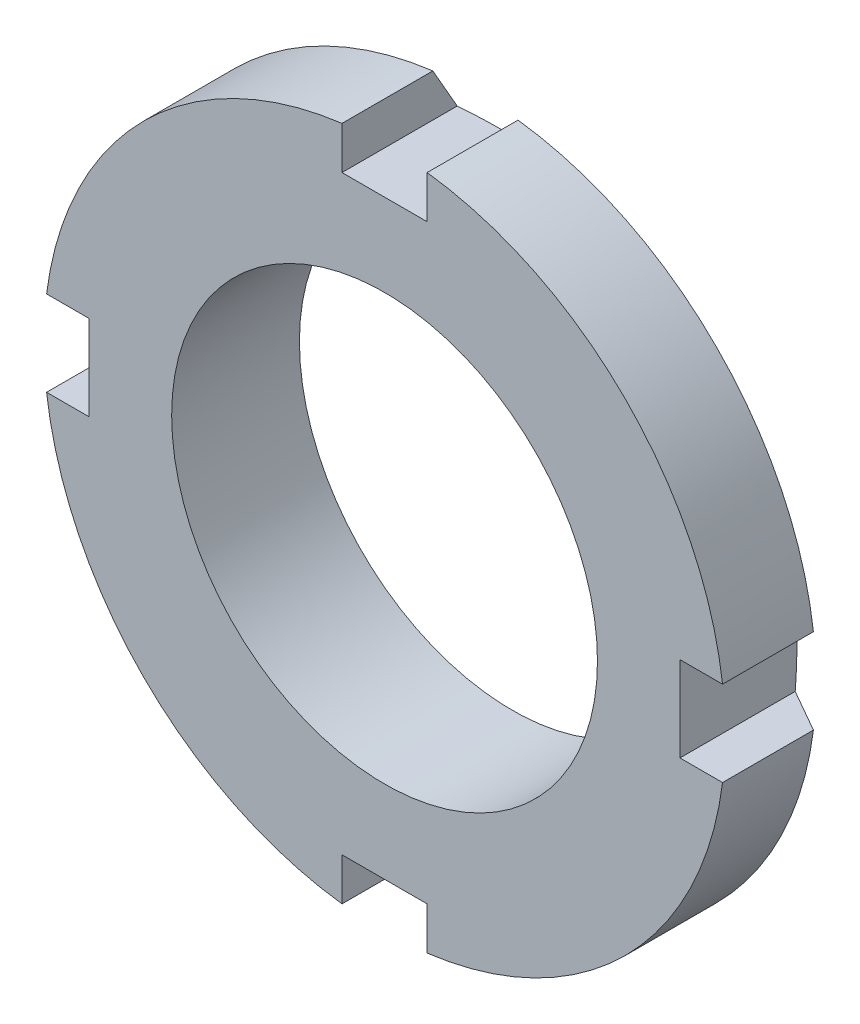
ISO-10303-21;
HEADER;
FILE_DESCRIPTION(('STEP AP214'),'2;1');
FILE_NAME('part.step','',(''),(''),'','','');
FILE_SCHEMA(('AUTOMOTIVE_DESIGN { 1 0 10303 214 1 1 1 1 }'));
ENDSEC;
DATA;
#1=APPLICATION_CONTEXT('core data for automotive mechanical design processes');
#2=APPLICATION_PROTOCOL_DEFINITION('international standard','automotive_design',2000,#1);
#3=PRODUCT_CONTEXT('',#1,'mechanical');
#4=PRODUCT('Part','Part','',(#3));
#5=PRODUCT_RELATED_PRODUCT_CATEGORY('part','',(#4));
#6=PRODUCT_DEFINITION_FORMATION('','',#4);
#7=PRODUCT_DEFINITION_CONTEXT('part definition',#1,'design');
#8=PRODUCT_DEFINITION('design','',#6,#7);
#9=PRODUCT_DEFINITION_SHAPE('','',#8);
#10=(LENGTH_UNIT() NAMED_UNIT(*) SI_UNIT(.MILLI.,.METRE.));
#11=(NAMED_UNIT(*) PLANE_ANGLE_UNIT() SI_UNIT($,.RADIAN.));
#12=(NAMED_UNIT(*) SI_UNIT($,.STERADIAN.) SOLID_ANGLE_UNIT());
#13=UNCERTAINTY_MEASURE_WITH_UNIT(LENGTH_MEASURE(1.E-05),#10,'distance_accuracy_value','');
#14=(GEOMETRIC_REPRESENTATION_CONTEXT(3) GLOBAL_UNCERTAINTY_ASSIGNED_CONTEXT((#13)) GLOBAL_UNIT_ASSIGNED_CONTEXT((#10,
#11,#12)) REPRESENTATION_CONTEXT('',''));
#15=CARTESIAN_POINT('',(0.,0.,0.));
#16=DIRECTION('',(0.,0.,1.));
#17=DIRECTION('',(1.,0.,0.));
#18=AXIS2_PLACEMENT_3D('',#15,#16,#17);
#19=CARTESIAN_POINT('',(0.,0.,0.));
#20=DIRECTION('',(0.,0.,-1.));
#21=DIRECTION('',(-1.,0.,0.));
#22=AXIS2_PLACEMENT_3D('',#19,#20,#21);
#23=CYLINDRICAL_SURFACE('',#22,16.);
#24=DIRECTION('',(0.,0.,-1.));
#25=VECTOR('',#24,1.);
#26=CARTESIAN_POINT('',(-2.,15.8745078663875,6.));
#27=LINE('',#26,#25);
#28=CARTESIAN_POINT('',(-2.,15.8745078663875,6.));
#29=VERTEX_POINT('',#28);
#30=CARTESIAN_POINT('',(-2.,15.8745078663875,1.73205080756888));
#31=VERTEX_POINT('',#30);
#32=EDGE_CURVE('E149',#29,#31,#27,.T.);
#33=ORIENTED_EDGE('',*,*,#32,.T.);
#34=CARTESIAN_POINT('',(0.,0.,1.73205080756888));
#35=DIRECTION('',(0.,0.,-1.));
#36=DIRECTION('',(-1.,0.,0.));
#37=AXIS2_PLACEMENT_3D('',#34,#35,#36);
#38=CIRCLE('',#37,16.);
#39=CARTESIAN_POINT('',(-15.8745078663875,2.,1.73205080756888));
#40=VERTEX_POINT('',#39);
#41=EDGE_CURVE('E186',#40,#31,#38,.T.);
#42=ORIENTED_EDGE('',*,*,#41,.F.);
#43=DIRECTION('',(0.,0.,-1.));
#44=VECTOR('',#43,1.);
#45=CARTESIAN_POINT('',(-15.8745078663875,2.,6.));
#46=LINE('',#45,#44);
#47=CARTESIAN_POINT('',(-15.8745078663875,2.,6.));
#48=VERTEX_POINT('',#47);
#49=EDGE_CURVE('E162',#48,#40,#46,.T.);
#50=ORIENTED_EDGE('',*,*,#49,.F.);
#51=CARTESIAN_POINT('',(0.,0.,6.));
#52=DIRECTION('',(0.,0.,-1.));
#53=DIRECTION('',(-1.,0.,0.));
#54=AXIS2_PLACEMENT_3D('',#51,#52,#53);
#55=CIRCLE('',#54,16.);
#56=EDGE_CURVE('E169',#48,#29,#55,.T.);
#57=ORIENTED_EDGE('',*,*,#56,.T.);
#58=EDGE_LOOP('',(#33,#42,#50,#57));
#59=FACE_BOUND('',#58,.T.);
#60=ADVANCED_FACE('F33',(#59),#23,.T.);
#61=DIRECTION('',(0.,0.,-1.));
#62=VECTOR('',#61,1.);
#63=CARTESIAN_POINT('',(-15.8745078663875,-2.,6.));
#64=LINE('',#63,#62);
#65=CARTESIAN_POINT('',(-15.8745078663875,-2.,6.));
#66=VERTEX_POINT('',#65);
#67=CARTESIAN_POINT('',(-15.8745078663875,-2.,1.73205080756888));
#68=VERTEX_POINT('',#67);
#69=EDGE_CURVE('E340',#66,#68,#64,.T.);
#70=ORIENTED_EDGE('',*,*,#69,.T.);
#71=CARTESIAN_POINT('',(-2.,-15.8745078663875,1.73205080756888));
#72=VERTEX_POINT('',#71);
#73=EDGE_CURVE('E192',#72,#68,#38,.T.);
#74=ORIENTED_EDGE('',*,*,#73,.F.);
#75=DIRECTION('',(0.,0.,-1.));
#76=VECTOR('',#75,1.);
#77=CARTESIAN_POINT('',(-2.,-15.8745078663875,6.));
#78=LINE('',#77,#76);
#79=CARTESIAN_POINT('',(-2.,-15.8745078663875,6.));
#80=VERTEX_POINT('',#79);
#81=EDGE_CURVE('E314',#80,#72,#78,.T.);
#82=ORIENTED_EDGE('',*,*,#81,.F.);
#83=EDGE_CURVE('E179',#80,#66,#55,.T.);
#84=ORIENTED_EDGE('',*,*,#83,.T.);
#85=EDGE_LOOP('',(#70,#74,#82,#84));
#86=FACE_BOUND('',#85,.T.);
#87=ADVANCED_FACE('F395',(#86),#23,.T.);
#88=DIRECTION('',(0.,0.,-1.));
#89=VECTOR('',#88,1.);
#90=CARTESIAN_POINT('',(2.,-15.8745078663875,6.));
#91=LINE('',#90,#89);
#92=CARTESIAN_POINT('',(2.,-15.8745078663875,6.));
#93=VERTEX_POINT('',#92);
#94=CARTESIAN_POINT('',(2.,-15.8745078663875,1.73205080756888));
#95=VERTEX_POINT('',#94);
#96=EDGE_CURVE('E330',#93,#95,#91,.T.);
#97=ORIENTED_EDGE('',*,*,#96,.T.);
#98=CARTESIAN_POINT('',(15.8745078663875,-2.,1.73205080756888));
#99=VERTEX_POINT('',#98);
#100=EDGE_CURVE('E196',#99,#95,#38,.T.);
#101=ORIENTED_EDGE('',*,*,#100,.F.);
#102=DIRECTION('',(0.,0.,-1.));
#103=VECTOR('',#102,1.);
#104=CARTESIAN_POINT('',(15.8745078663875,-2.,6.));
#105=LINE('',#104,#103);
#106=CARTESIAN_POINT('',(15.8745078663875,-2.,6.));
#107=VERTEX_POINT('',#106);
#108=EDGE_CURVE('E328',#107,#99,#105,.T.);
#109=ORIENTED_EDGE('',*,*,#108,.F.);
#110=EDGE_CURVE('E183',#107,#93,#55,.T.);
#111=ORIENTED_EDGE('',*,*,#110,.T.);
#112=EDGE_LOOP('',(#97,#101,#109,#111));
#113=FACE_BOUND('',#112,.T.);
#114=ADVANCED_FACE('F327',(#113),#23,.T.);
#115=CARTESIAN_POINT('',(0.,0.,0.));
#116=DIRECTION('',(0.,0.,1.));
#117=DIRECTION('',(1.,0.,0.));
#118=AXIS2_PLACEMENT_3D('',#115,#116,#117);
#119=CONICAL_SURFACE('',#118,13.,1.0471975511966);
#120=CARTESIAN_POINT('',(-19.8478725985522,2.,4.01165169809851));
#121=CARTESIAN_POINT('',(-19.1389411025634,2.,3.60443009352603));
#122=CARTESIAN_POINT('',(-18.4299294026001,2.,3.19734788230786));
#123=CARTESIAN_POINT('',(-17.0116378149602,2.,2.38365272365911));
#124=CARTESIAN_POINT('',(-16.3023579275712,2.,1.97703977572706));
#125=CARTESIAN_POINT('',(-14.8834201177405,2.,1.16447243297082));
#126=CARTESIAN_POINT('',(-14.1737621950055,2.,0.758518038658796));
#127=CARTESIAN_POINT('',(-13.1088352758322,2.,0.150355983976441));
#128=CARTESIAN_POINT('',(-12.753786107743,2.,-0.0522365524654286));
#129=CARTESIAN_POINT('',(-12.043496535997,2.,-0.457086343424855));
#130=CARTESIAN_POINT('',(-11.6882561322797,2.,-0.659343597836597));
#131=CARTESIAN_POINT('',(-11.3328978813005,2.,-0.86139379869573));
#132=B_SPLINE_CURVE_WITH_KNOTS('',3,(#120,#121,#122,#123,#124,#125,#126,#127,#128,#129,#130,
#131),.UNSPECIFIED.,.F.,.F.,(4,2,2,2,2,4),(0.,2.45269656602665,4.90539050865713,
7.35808635786109,8.58443558856285,9.81078520622847),.UNSPECIFIED.);
#133=CARTESIAN_POINT('',(-13.8745078663875,2.,0.587694067374146));
#134=VERTEX_POINT('',#133);
#135=EDGE_CURVE('E235',#40,#134,#132,.T.);
#136=ORIENTED_EDGE('',*,*,#135,.F.);
#137=ORIENTED_EDGE('',*,*,#41,.T.);
#138=CARTESIAN_POINT('',(-2.,9.8264067869233,-1.71595736092801));
#139=CARTESIAN_POINT('',(-2.,10.1821927600855,-1.51465946073477));
#140=CARTESIAN_POINT('',(-2.,10.5378027304212,-1.31305098935909));
#141=CARTESIAN_POINT('',(-2.,11.2487432175336,-0.909342439363823));
#142=CARTESIAN_POINT('',(-2.,11.604073734508,-0.70724236109263));
#143=CARTESIAN_POINT('',(-2.,12.6697542586465,-0.10039940427271));
#144=CARTESIAN_POINT('',(-2.,13.3797946711892,0.304887007951091));
#145=CARTESIAN_POINT('',(-2.,14.7993681118396,1.11634418292386));
#146=CARTESIAN_POINT('',(-2.,15.5089011407652,1.52251494424292));
#147=CARTESIAN_POINT('',(-2.,16.9276181405181,2.33546903546284));
#148=CARTESIAN_POINT('',(-2.,17.636802110637,2.74225236659997));
#149=CARTESIAN_POINT('',(-2.,18.3458887068915,3.1492049436852));
#150=B_SPLINE_CURVE_WITH_KNOTS('',3,(#138,#139,#140,#141,#142,#143,#144,#145,#146,#147,#148,
#149),.UNSPECIFIED.,.F.,.F.,(4,2,2,2,2,4),(0.,1.22635201141246,2.4527031539539,4.90540050051748,
7.35809388424146,9.81079222455834),.UNSPECIFIED.);
#151=CARTESIAN_POINT('',(-2.,13.8745078663875,0.587694067374146));
#152=VERTEX_POINT('',#151);
#153=EDGE_CURVE('E156',#152,#31,#150,.T.);
#154=ORIENTED_EDGE('',*,*,#153,.F.);
#155=CARTESIAN_POINT('',(6.04182336794165,13.8745078663875,1.23144823919128));
#156=CARTESIAN_POINT('',(5.73063061987793,13.8745078663875,1.1597083728085));
#157=CARTESIAN_POINT('',(5.41838778989448,13.8745078663875,1.09239925182133));
#158=CARTESIAN_POINT('',(4.79189692963628,13.8745078663875,0.967500244051134));
#159=CARTESIAN_POINT('',(4.47764847195894,13.8745078663875,0.909912505914482));
#160=CARTESIAN_POINT('',(3.84704148666313,13.8745078663875,0.80529047794053));
#161=CARTESIAN_POINT('',(3.530681060298,13.8745078663875,0.758267551832122));
#162=CARTESIAN_POINT('',(2.89648649857966,13.8745078663875,0.675648576450018));
#163=CARTESIAN_POINT('',(2.57865246821841,13.8745078663875,0.640051725402591));
#164=CARTESIAN_POINT('',(1.94839121058944,13.8745078663875,0.581544446665095));
#165=CARTESIAN_POINT('',(1.6359868715526,13.8745078663875,0.558388674516741));
#166=CARTESIAN_POINT('',(1.01051204365425,13.8745078663875,0.524103785614805));
#167=CARTESIAN_POINT('',(0.697441548713531,13.8745078663875,0.512974779090845));
#168=CARTESIAN_POINT('',(0.0713288918016499,13.8745078663875,0.502967046439731));
#169=CARTESIAN_POINT('',(-0.241713127764934,13.8745078663875,0.504079491166037));
#170=CARTESIAN_POINT('',(-0.867515728538272,13.8745078663875,0.518509931221569));
#171=CARTESIAN_POINT('',(-1.18027630582828,13.8745078663875,0.531828093863045));
#172=CARTESIAN_POINT('',(-1.85622061696714,13.8745078663875,0.573574179463501));
#173=CARTESIAN_POINT('',(-2.21927454783292,13.8745078663875,0.604119255690277));
#174=CARTESIAN_POINT('',(-2.94375306509076,13.8745078663875,0.680629335733219));
#175=CARTESIAN_POINT('',(-3.30517758112463,13.8745078663875,0.726594999068989));
#176=CARTESIAN_POINT('',(-4.02634188524678,13.8745078663875,0.832945259175453));
#177=CARTESIAN_POINT('',(-4.38607903813662,13.8745078663875,0.893347611565186));
#178=CARTESIAN_POINT('',(-5.10310224514555,13.8745078663875,1.02729500928867));
#179=CARTESIAN_POINT('',(-5.460388166134,13.8745078663875,1.10084076268673));
#180=CARTESIAN_POINT('',(-6.18125690827378,13.8745078663875,1.26174599900639));
#181=CARTESIAN_POINT('',(-6.54477225269676,13.8745078663875,1.34940624993152));
#182=CARTESIAN_POINT('',(-7.26898372588383,13.8745078663875,1.53574081330761));
#183=CARTESIAN_POINT('',(-7.62967964673607,13.8745078663875,1.63441592997645));
#184=CARTESIAN_POINT('',(-8.34718971175171,13.8745078663875,1.84112295471384));
#185=CARTESIAN_POINT('',(-8.70401227059214,13.8745078663875,1.94912581373169));
#186=CARTESIAN_POINT('',(-9.41490810175121,13.8745078663875,2.17353445381309));
#187=CARTESIAN_POINT('',(-9.76898206412494,13.8745078663875,2.28993804492159));
#188=CARTESIAN_POINT('',(-10.121791615005,13.8745078663875,2.40996689420786));
#189=B_SPLINE_CURVE_WITH_KNOTS('',3,(#155,#156,#157,#158,#159,#160,#161,#162,#163,#164,#165,
#166,#167,#168,#169,#170,#171,#172,#173,#174,#175,#176,#177,#178,#179,#180,#181,#182,#183,#184,
#185,#186,#187,#188),.UNSPECIFIED.,.F.,.F.,(4,2,2,2,2,2,2,2,2,2,2,2,2,2,2,2,4),(0.,
0.95807380629723,1.91635909219511,2.87567024660431,3.83491407091909,4.77447354275729,
5.71404162592218,6.6529320900634,7.59183542442062,8.68448802879566,9.77718737054165,
10.8712375971803,11.9653467805195,13.0869589702547,14.2086531048213,15.3269719430504,
16.4450002967606),.UNSPECIFIED.);
#190=CARTESIAN_POINT('',(2.,13.8745078663875,0.587694067374146));
#191=VERTEX_POINT('',#190);
#192=EDGE_CURVE('E249',#191,#152,#189,.T.);
#193=ORIENTED_EDGE('',*,*,#192,.F.);
#194=CARTESIAN_POINT('',(2.,18.3458887068915,3.1492049436852));
#195=CARTESIAN_POINT('',(2.,17.6368021106369,2.74225236659997));
#196=CARTESIAN_POINT('',(2.,16.9276181405181,2.33546903546284));
#197=CARTESIAN_POINT('',(2.,15.5089011407652,1.52251494424292));
#198=CARTESIAN_POINT('',(2.,14.7993681118396,1.11634418292386));
#199=CARTESIAN_POINT('',(2.,13.3797946711892,0.304887007951092));
#200=CARTESIAN_POINT('',(2.,12.6697542586465,-0.100399404272709));
#201=CARTESIAN_POINT('',(2.,11.604073734508,-0.70724236109263));
#202=CARTESIAN_POINT('',(2.,11.2487432175336,-0.909342439363822));
#203=CARTESIAN_POINT('',(2.,10.5378027304212,-1.31305098935909));
#204=CARTESIAN_POINT('',(2.,10.1821927600855,-1.51465946073477));
#205=CARTESIAN_POINT('',(2.,9.8264067869233,-1.71595736092801));
#206=B_SPLINE_CURVE_WITH_KNOTS('',3,(#194,#195,#196,#197,#198,#199,#200,#201,#202,#203,#204,
#205),.UNSPECIFIED.,.F.,.F.,(4,2,2,2,2,4),(0.,2.45269834031688,4.90539172404086,
7.35808907060444,8.58444021314588,9.81079222455834),.UNSPECIFIED.);
#207=CARTESIAN_POINT('',(2.,15.8745078663875,1.73205080756888));
#208=VERTEX_POINT('',#207);
#209=EDGE_CURVE('E161',#208,#191,#206,.T.);
#210=ORIENTED_EDGE('',*,*,#209,.F.);
#211=CARTESIAN_POINT('',(15.8745078663875,2.,1.73205080756888));
#212=VERTEX_POINT('',#211);
#213=EDGE_CURVE('E191',#208,#212,#38,.T.);
#214=ORIENTED_EDGE('',*,*,#213,.T.);
#215=CARTESIAN_POINT('',(9.8264067869233,2.,-1.71595736092801));
#216=CARTESIAN_POINT('',(10.1821927600855,2.,-1.51465946073477));
#217=CARTESIAN_POINT('',(10.5378027304212,2.,-1.31305098935909));
#218=CARTESIAN_POINT('',(11.2487432175336,2.,-0.909342439363823));
#219=CARTESIAN_POINT('',(11.604073734508,2.,-0.70724236109263));
#220=CARTESIAN_POINT('',(12.6697542586465,2.,-0.10039940427271));
#221=CARTESIAN_POINT('',(13.3797946711892,2.,0.304887007951091));
#222=CARTESIAN_POINT('',(14.7993681118396,2.,1.11634418292386));
#223=CARTESIAN_POINT('',(15.5089011407652,2.,1.52251494424292));
#224=CARTESIAN_POINT('',(16.9276181405181,2.,2.33546903546284));
#225=CARTESIAN_POINT('',(17.636802110637,2.,2.74225236659997));
#226=CARTESIAN_POINT('',(18.3458887068915,2.,3.1492049436852));
#227=B_SPLINE_CURVE_WITH_KNOTS('',3,(#215,#216,#217,#218,#219,#220,#221,#222,#223,#224,#225,
#226),.UNSPECIFIED.,.F.,.F.,(4,2,2,2,2,4),(0.,1.22635201141246,2.4527031539539,4.90540050051748,
7.35809388424146,9.81079222455834),.UNSPECIFIED.);
#228=CARTESIAN_POINT('',(13.8745078663875,2.,0.587694067374146));
#229=VERTEX_POINT('',#228);
#230=EDGE_CURVE('E275',#229,#212,#227,.T.);
#231=ORIENTED_EDGE('',*,*,#230,.F.);
#232=CARTESIAN_POINT('',(13.8745078663875,-10.121791615005,2.40996689420786));
#233=CARTESIAN_POINT('',(13.8745078663875,-9.76898206412494,2.28993804492159));
#234=CARTESIAN_POINT('',(13.8745078663875,-9.41490810175121,2.17353445381309));
#235=CARTESIAN_POINT('',(13.8745078663875,-8.70401227059214,1.94912581373169));
#236=CARTESIAN_POINT('',(13.8745078663875,-8.34718971175171,1.84112295471384));
#237=CARTESIAN_POINT('',(13.8745078663875,-7.62967964673607,1.63441592997645));
#238=CARTESIAN_POINT('',(13.8745078663875,-7.26898372588383,1.53574081330761));
#239=CARTESIAN_POINT('',(13.8745078663875,-6.54477225269676,1.34940624993153));
#240=CARTESIAN_POINT('',(13.8745078663875,-6.18125690827378,1.26174599900639));
#241=CARTESIAN_POINT('',(13.8745078663875,-5.460388166134,1.10084076268673));
#242=CARTESIAN_POINT('',(13.8745078663875,-5.10310224514555,1.02729500928867));
#243=CARTESIAN_POINT('',(13.8745078663875,-4.38607903813662,0.893347611565186));
#244=CARTESIAN_POINT('',(13.8745078663875,-4.02634188524679,0.832945259175453));
#245=CARTESIAN_POINT('',(13.8745078663875,-3.30517758112463,0.726594999068988));
#246=CARTESIAN_POINT('',(13.8745078663875,-2.94375306509076,0.680629335733219));
#247=CARTESIAN_POINT('',(13.8745078663875,-2.21927454783292,0.604119255690277));
#248=CARTESIAN_POINT('',(13.8745078663875,-1.85622061696714,0.573574179463502));
#249=CARTESIAN_POINT('',(13.8745078663875,-1.18027630582828,0.531828093863045));
#250=CARTESIAN_POINT('',(13.8745078663875,-0.867515728538272,0.518509931221569));
#251=CARTESIAN_POINT('',(13.8745078663875,-0.241713127764934,0.504079491166037));
#252=CARTESIAN_POINT('',(13.8745078663875,0.0713288918016497,0.502967046439731));
#253=CARTESIAN_POINT('',(13.8745078663875,0.697441548713531,0.512974779090845));
#254=CARTESIAN_POINT('',(13.8745078663875,1.01051204365425,0.524103785614805));
#255=CARTESIAN_POINT('',(13.8745078663875,1.6359868715526,0.558388674516741));
#256=CARTESIAN_POINT('',(13.8745078663875,1.94839121058944,0.581544446665095));
#257=CARTESIAN_POINT('',(13.8745078663875,2.57865246821841,0.640051725402591));
#258=CARTESIAN_POINT('',(13.8745078663875,2.89648649857966,0.675648576450018));
#259=CARTESIAN_POINT('',(13.8745078663875,3.530681060298,0.758267551832122));
#260=CARTESIAN_POINT('',(13.8745078663875,3.84704148666313,0.80529047794053));
#261=CARTESIAN_POINT('',(13.8745078663875,4.47764847195894,0.909912505914482));
#262=CARTESIAN_POINT('',(13.8745078663875,4.79189692963628,0.967500244051134));
#263=CARTESIAN_POINT('',(13.8745078663875,5.41838778989448,1.09239925182133));
#264=CARTESIAN_POINT('',(13.8745078663875,5.73063061987793,1.1597083728085));
#265=CARTESIAN_POINT('',(13.8745078663875,6.04182336794165,1.23144823919128));
#266=B_SPLINE_CURVE_WITH_KNOTS('',3,(#232,#233,#234,#235,#236,#237,#238,#239,#240,#241,#242,
#243,#244,#245,#246,#247,#248,#249,#250,#251,#252,#253,#254,#255,#256,#257,#258,#259,#260,#261,
#262,#263,#264,#265),.UNSPECIFIED.,.F.,.F.,(4,2,2,2,2,2,2,2,2,2,2,2,2,2,2,2,4),(0.,
1.11802835371021,2.23634719193922,3.35804132650583,4.47965351624111,5.5737626995803,
6.66781292621892,7.7605122679649,8.85316487233995,9.79206820669717,10.7309586708384,
11.6705267540033,12.6100862258415,13.5693300501563,14.5286412045655,15.4869264904633,
16.4450002967606),.UNSPECIFIED.);
#267=CARTESIAN_POINT('',(13.8745078663875,-2.,0.587694067374146));
#268=VERTEX_POINT('',#267);
#269=EDGE_CURVE('E207',#268,#229,#266,.T.);
#270=ORIENTED_EDGE('',*,*,#269,.F.);
#271=CARTESIAN_POINT('',(18.3458887068915,-2.,3.1492049436852));
#272=CARTESIAN_POINT('',(17.6368021106369,-2.,2.74225236659997));
#273=CARTESIAN_POINT('',(16.9276181405181,-2.,2.33546903546284));
#274=CARTESIAN_POINT('',(15.5089011407652,-2.,1.52251494424292));
#275=CARTESIAN_POINT('',(14.7993681118396,-2.,1.11634418292386));
#276=CARTESIAN_POINT('',(13.3797946711892,-2.,0.304887007951092));
#277=CARTESIAN_POINT('',(12.6697542586465,-2.,-0.100399404272709));
#278=CARTESIAN_POINT('',(11.604073734508,-2.,-0.70724236109263));
#279=CARTESIAN_POINT('',(11.2487432175336,-2.,-0.909342439363822));
#280=CARTESIAN_POINT('',(10.5378027304212,-2.,-1.31305098935909));
#281=CARTESIAN_POINT('',(10.1821927600855,-2.,-1.51465946073477));
#282=CARTESIAN_POINT('',(9.8264067869233,-2.,-1.71595736092801));
#283=B_SPLINE_CURVE_WITH_KNOTS('',3,(#271,#272,#273,#274,#275,#276,#277,#278,#279,#280,#281,
#282),.UNSPECIFIED.,.F.,.F.,(4,2,2,2,2,4),(0.,2.45269834031688,4.90539172404086,
7.35808907060444,8.58444021314588,9.81079222455834),.UNSPECIFIED.);
#284=EDGE_CURVE('E281',#99,#268,#283,.T.);
#285=ORIENTED_EDGE('',*,*,#284,.F.);
#286=ORIENTED_EDGE('',*,*,#100,.T.);
#287=CARTESIAN_POINT('',(2.,-11.3328978813005,-0.86139379869573));
#288=CARTESIAN_POINT('',(2.,-11.6882561322797,-0.659343597836596));
#289=CARTESIAN_POINT('',(2.,-12.043496535997,-0.457086343424855));
#290=CARTESIAN_POINT('',(2.,-12.753786107743,-0.0522365524654286));
#291=CARTESIAN_POINT('',(2.,-13.1088352758322,0.150355983976441));
#292=CARTESIAN_POINT('',(2.,-14.1737621950055,0.758518038658795));
#293=CARTESIAN_POINT('',(2.,-14.8834201177405,1.16447243297082));
#294=CARTESIAN_POINT('',(2.,-16.3023579275712,1.97703977572706));
#295=CARTESIAN_POINT('',(2.,-17.0116378149602,2.38365272365911));
#296=CARTESIAN_POINT('',(2.,-18.4299294026001,3.19734788230786));
#297=CARTESIAN_POINT('',(2.,-19.1389411025634,3.60443009352603));
#298=CARTESIAN_POINT('',(2.,-19.8478725985522,4.01165169809851));
#299=B_SPLINE_CURVE_WITH_KNOTS('',3,(#287,#288,#289,#290,#291,#292,#293,#294,#295,#296,#297,
#298),.UNSPECIFIED.,.F.,.F.,(4,2,2,2,2,4),(0.,1.22634961766562,2.45269884836738,
4.90539469757134,7.35808864020182,9.81078520622847),.UNSPECIFIED.);
#300=CARTESIAN_POINT('',(2.,-13.8745078663875,0.587694067374146));
#301=VERTEX_POINT('',#300);
#302=EDGE_CURVE('E57',#301,#95,#299,.T.);
#303=ORIENTED_EDGE('',*,*,#302,.F.);
#304=CARTESIAN_POINT('',(-10.121791615005,-13.8745078663875,2.40996689420786));
#305=CARTESIAN_POINT('',(-9.76898206412494,-13.8745078663875,2.28993804492159));
#306=CARTESIAN_POINT('',(-9.41490810175121,-13.8745078663875,2.17353445381309));
#307=CARTESIAN_POINT('',(-8.70401227059214,-13.8745078663875,1.94912581373169));
#308=CARTESIAN_POINT('',(-8.34718971175171,-13.8745078663875,1.84112295471384));
#309=CARTESIAN_POINT('',(-7.62967964673607,-13.8745078663875,1.63441592997645));
#310=CARTESIAN_POINT('',(-7.26898372588383,-13.8745078663875,1.53574081330761));
#311=CARTESIAN_POINT('',(-6.54477225269676,-13.8745078663875,1.34940624993153));
#312=CARTESIAN_POINT('',(-6.18125690827378,-13.8745078663875,1.26174599900639));
#313=CARTESIAN_POINT('',(-5.460388166134,-13.8745078663875,1.10084076268673));
#314=CARTESIAN_POINT('',(-5.10310224514555,-13.8745078663875,1.02729500928867));
#315=CARTESIAN_POINT('',(-4.38607903813662,-13.8745078663875,0.893347611565186));
#316=CARTESIAN_POINT('',(-4.02634188524679,-13.8745078663875,0.832945259175453));
#317=CARTESIAN_POINT('',(-3.30517758112463,-13.8745078663875,0.726594999068988));
#318=CARTESIAN_POINT('',(-2.94375306509076,-13.8745078663875,0.680629335733219));
#319=CARTESIAN_POINT('',(-2.21927454783292,-13.8745078663875,0.604119255690277));
#320=CARTESIAN_POINT('',(-1.85622061696714,-13.8745078663875,0.573574179463502));
#321=CARTESIAN_POINT('',(-1.18027630582828,-13.8745078663875,0.531828093863045));
#322=CARTESIAN_POINT('',(-0.867515728538272,-13.8745078663875,0.518509931221569));
#323=CARTESIAN_POINT('',(-0.241713127764934,-13.8745078663875,0.504079491166037));
#324=CARTESIAN_POINT('',(0.0713288918016497,-13.8745078663875,0.502967046439731));
#325=CARTESIAN_POINT('',(0.697441548713531,-13.8745078663875,0.512974779090845));
#326=CARTESIAN_POINT('',(1.01051204365425,-13.8745078663875,0.524103785614805));
#327=CARTESIAN_POINT('',(1.6359868715526,-13.8745078663875,0.558388674516741));
#328=CARTESIAN_POINT('',(1.94839121058944,-13.8745078663875,0.581544446665095));
#329=CARTESIAN_POINT('',(2.57865246821841,-13.8745078663875,0.640051725402591));
#330=CARTESIAN_POINT('',(2.89648649857966,-13.8745078663875,0.675648576450018));
#331=CARTESIAN_POINT('',(3.530681060298,-13.8745078663875,0.758267551832122));
#332=CARTESIAN_POINT('',(3.84704148666313,-13.8745078663875,0.80529047794053));
#333=CARTESIAN_POINT('',(4.47764847195894,-13.8745078663875,0.909912505914482));
#334=CARTESIAN_POINT('',(4.79189692963628,-13.8745078663875,0.967500244051134));
#335=CARTESIAN_POINT('',(5.41838778989448,-13.8745078663875,1.09239925182133));
#336=CARTESIAN_POINT('',(5.73063061987793,-13.8745078663875,1.1597083728085));
#337=CARTESIAN_POINT('',(6.04182336794165,-13.8745078663875,1.23144823919128));
#338=B_SPLINE_CURVE_WITH_KNOTS('',3,(#304,#305,#306,#307,#308,#309,#310,#311,#312,#313,#314,
#315,#316,#317,#318,#319,#320,#321,#322,#323,#324,#325,#326,#327,#328,#329,#330,#331,#332,#333,
#334,#335,#336,#337),.UNSPECIFIED.,.F.,.F.,(4,2,2,2,2,2,2,2,2,2,2,2,2,2,2,2,4),(0.,
1.11802835371021,2.23634719193922,3.35804132650583,4.47965351624111,5.5737626995803,
6.66781292621892,7.7605122679649,8.85316487233995,9.79206820669717,10.7309586708384,
11.6705267540033,12.6100862258415,13.5693300501563,14.5286412045655,15.4869264904633,
16.4450002967606),.UNSPECIFIED.);
#339=CARTESIAN_POINT('',(-2.,-13.8745078663875,0.587694067374146));
#340=VERTEX_POINT('',#339);
#341=EDGE_CURVE('E203',#340,#301,#338,.T.);
#342=ORIENTED_EDGE('',*,*,#341,.F.);
#343=CARTESIAN_POINT('',(-2.,-19.8478725985522,4.01165169809851));
#344=CARTESIAN_POINT('',(-2.,-19.1389411025634,3.60443009352603));
#345=CARTESIAN_POINT('',(-2.,-18.4299294026001,3.19734788230786));
#346=CARTESIAN_POINT('',(-2.,-17.0116378149602,2.38365272365911));
#347=CARTESIAN_POINT('',(-2.,-16.3023579275712,1.97703977572706));
#348=CARTESIAN_POINT('',(-2.,-14.8834201177405,1.16447243297082));
#349=CARTESIAN_POINT('',(-2.,-14.1737621950055,0.758518038658796));
#350=CARTESIAN_POINT('',(-2.,-13.1088352758322,0.150355983976441));
#351=CARTESIAN_POINT('',(-2.,-12.753786107743,-0.0522365524654286));
#352=CARTESIAN_POINT('',(-2.,-12.043496535997,-0.457086343424855));
#353=CARTESIAN_POINT('',(-2.,-11.6882561322797,-0.659343597836597));
#354=CARTESIAN_POINT('',(-2.,-11.3328978813005,-0.86139379869573));
#355=B_SPLINE_CURVE_WITH_KNOTS('',3,(#343,#344,#345,#346,#347,#348,#349,#350,#351,#352,#353,
#354),.UNSPECIFIED.,.F.,.F.,(4,2,2,2,2,4),(0.,2.45269656602665,4.90539050865713,
7.35808635786109,8.58443558856285,9.81078520622847),.UNSPECIFIED.);
#356=EDGE_CURVE('E307',#72,#340,#355,.T.);
#357=ORIENTED_EDGE('',*,*,#356,.F.);
#358=ORIENTED_EDGE('',*,*,#73,.T.);
#359=CARTESIAN_POINT('',(-11.3328978813005,-2.,-0.86139379869573));
#360=CARTESIAN_POINT('',(-11.6882561322797,-2.,-0.659343597836596));
#361=CARTESIAN_POINT('',(-12.043496535997,-2.,-0.457086343424855));
#362=CARTESIAN_POINT('',(-12.753786107743,-2.,-0.0522365524654286));
#363=CARTESIAN_POINT('',(-13.1088352758322,-2.,0.150355983976441));
#364=CARTESIAN_POINT('',(-14.1737621950055,-2.,0.758518038658795));
#365=CARTESIAN_POINT('',(-14.8834201177405,-2.,1.16447243297082));
#366=CARTESIAN_POINT('',(-16.3023579275712,-2.,1.97703977572706));
#367=CARTESIAN_POINT('',(-17.0116378149602,-2.,2.38365272365911));
#368=CARTESIAN_POINT('',(-18.4299294026001,-2.,3.19734788230786));
#369=CARTESIAN_POINT('',(-19.1389411025634,-2.,3.60443009352603));
#370=CARTESIAN_POINT('',(-19.8478725985522,-2.,4.01165169809851));
#371=B_SPLINE_CURVE_WITH_KNOTS('',3,(#359,#360,#361,#362,#363,#364,#365,#366,#367,#368,#369,
#370),.UNSPECIFIED.,.F.,.F.,(4,2,2,2,2,4),(0.,1.22634961766562,2.45269884836738,
4.90539469757134,7.35808864020182,9.81078520622847),.UNSPECIFIED.);
#372=CARTESIAN_POINT('',(-13.8745078663875,-2.,0.587694067374146));
#373=VERTEX_POINT('',#372);
#374=EDGE_CURVE('E49',#373,#68,#371,.T.);
#375=ORIENTED_EDGE('',*,*,#374,.F.);
#376=CARTESIAN_POINT('',(-13.8745078663875,6.04182336794165,1.23144823919128));
#377=CARTESIAN_POINT('',(-13.8745078663875,5.73063061987793,1.1597083728085));
#378=CARTESIAN_POINT('',(-13.8745078663875,5.41838778989448,1.09239925182133));
#379=CARTESIAN_POINT('',(-13.8745078663875,4.79189692963628,0.967500244051134));
#380=CARTESIAN_POINT('',(-13.8745078663875,4.47764847195894,0.909912505914482));
#381=CARTESIAN_POINT('',(-13.8745078663875,3.84704148666313,0.80529047794053));
#382=CARTESIAN_POINT('',(-13.8745078663875,3.530681060298,0.758267551832122));
#383=CARTESIAN_POINT('',(-13.8745078663875,2.89648649857966,0.675648576450018));
#384=CARTESIAN_POINT('',(-13.8745078663875,2.57865246821841,0.640051725402591));
#385=CARTESIAN_POINT('',(-13.8745078663875,1.94839121058944,0.581544446665095));
#386=CARTESIAN_POINT('',(-13.8745078663875,1.6359868715526,0.558388674516741));
#387=CARTESIAN_POINT('',(-13.8745078663875,1.01051204365425,0.524103785614805));
#388=CARTESIAN_POINT('',(-13.8745078663875,0.697441548713531,0.512974779090845));
#389=CARTESIAN_POINT('',(-13.8745078663875,0.0713288918016499,0.502967046439731));
#390=CARTESIAN_POINT('',(-13.8745078663875,-0.241713127764934,0.504079491166037));
#391=CARTESIAN_POINT('',(-13.8745078663875,-0.867515728538272,0.518509931221569));
#392=CARTESIAN_POINT('',(-13.8745078663875,-1.18027630582828,0.531828093863045));
#393=CARTESIAN_POINT('',(-13.8745078663875,-1.85622061696714,0.573574179463501));
#394=CARTESIAN_POINT('',(-13.8745078663875,-2.21927454783292,0.604119255690277));
#395=CARTESIAN_POINT('',(-13.8745078663875,-2.94375306509076,0.680629335733219));
#396=CARTESIAN_POINT('',(-13.8745078663875,-3.30517758112463,0.726594999068989));
#397=CARTESIAN_POINT('',(-13.8745078663875,-4.02634188524678,0.832945259175453));
#398=CARTESIAN_POINT('',(-13.8745078663875,-4.38607903813662,0.893347611565186));
#399=CARTESIAN_POINT('',(-13.8745078663875,-5.10310224514555,1.02729500928867));
#400=CARTESIAN_POINT('',(-13.8745078663875,-5.460388166134,1.10084076268673));
#401=CARTESIAN_POINT('',(-13.8745078663875,-6.18125690827378,1.26174599900639));
#402=CARTESIAN_POINT('',(-13.8745078663875,-6.54477225269676,1.34940624993152));
#403=CARTESIAN_POINT('',(-13.8745078663875,-7.26898372588383,1.53574081330761));
#404=CARTESIAN_POINT('',(-13.8745078663875,-7.62967964673607,1.63441592997645));
#405=CARTESIAN_POINT('',(-13.8745078663875,-8.34718971175171,1.84112295471384));
#406=CARTESIAN_POINT('',(-13.8745078663875,-8.70401227059214,1.94912581373169));
#407=CARTESIAN_POINT('',(-13.8745078663875,-9.41490810175121,2.17353445381309));
#408=CARTESIAN_POINT('',(-13.8745078663875,-9.76898206412494,2.28993804492159));
#409=CARTESIAN_POINT('',(-13.8745078663875,-10.121791615005,2.40996689420786));
#410=B_SPLINE_CURVE_WITH_KNOTS('',3,(#376,#377,#378,#379,#380,#381,#382,#383,#384,#385,#386,
#387,#388,#389,#390,#391,#392,#393,#394,#395,#396,#397,#398,#399,#400,#401,#402,#403,#404,#405,
#406,#407,#408,#409),.UNSPECIFIED.,.F.,.F.,(4,2,2,2,2,2,2,2,2,2,2,2,2,2,2,2,4),(0.,
0.95807380629723,1.91635909219511,2.87567024660431,3.83491407091909,4.77447354275729,
5.71404162592218,6.6529320900634,7.59183542442062,8.68448802879566,9.77718737054165,
10.8712375971803,11.9653467805195,13.0869589702547,14.2086531048213,15.3269719430504,
16.4450002967606),.UNSPECIFIED.);
#411=EDGE_CURVE('E199',#134,#373,#410,.T.);
#412=ORIENTED_EDGE('',*,*,#411,.F.);
#413=EDGE_LOOP('',(#136,#137,#154,#193,#210,#214,#231,#270,#285,#286,#303,#342,#357,#358,#375,#412));
#414=FACE_BOUND('',#413,.T.);
#415=CARTESIAN_POINT('',(0.,0.,0.));
#416=DIRECTION('',(0.,0.,-1.));
#417=DIRECTION('',(-1.,0.,0.));
#418=AXIS2_PLACEMENT_3D('',#415,#416,#417);
#419=CIRCLE('',#418,13.);
#420=CARTESIAN_POINT('',(-13.,0.,0.));
#421=VERTEX_POINT('',#420);
#422=EDGE_CURVE('E12',#421,#421,#419,.T.);
#423=ORIENTED_EDGE('',*,*,#422,.F.);
#424=EDGE_LOOP('',(#423));
#425=FACE_BOUND('',#424,.T.);
#426=ADVANCED_FACE('F35',(#414,#425),#119,.T.);
#427=CARTESIAN_POINT('',(0.,10.,0.));
#428=DIRECTION('',(0.,0.,-1.));
#429=DIRECTION('',(-1.,0.,0.));
#430=AXIS2_PLACEMENT_3D('',#427,#428,#429);
#431=PLANE('',#430);
#432=ORIENTED_EDGE('',*,*,#422,.T.);
#433=EDGE_LOOP('',(#432));
#434=FACE_BOUND('',#433,.T.);
#435=CARTESIAN_POINT('',(0.,0.,0.));
#436=DIRECTION('',(0.,0.,-1.));
#437=DIRECTION('',(-1.,0.,0.));
#438=AXIS2_PLACEMENT_3D('',#435,#436,#437);
#439=CIRCLE('',#438,10.);
#440=CARTESIAN_POINT('',(-10.,0.,0.));
#441=VERTEX_POINT('',#440);
#442=EDGE_CURVE('E42',#441,#441,#439,.T.);
#443=ORIENTED_EDGE('',*,*,#442,.F.);
#444=EDGE_LOOP('',(#443));
#445=FACE_BOUND('',#444,.T.);
#446=ADVANCED_FACE('F415',(#434,#445),#431,.T.);
#447=CARTESIAN_POINT('',(0.,0.,0.));
#448=DIRECTION('',(0.,0.,-1.));
#449=DIRECTION('',(-1.,0.,0.));
#450=AXIS2_PLACEMENT_3D('',#447,#448,#449);
#451=CYLINDRICAL_SURFACE('',#450,10.);
#452=ORIENTED_EDGE('',*,*,#442,.T.);
#453=EDGE_LOOP('',(#452));
#454=FACE_BOUND('',#453,.T.);
#455=CARTESIAN_POINT('',(0.,0.,5.99999999999999));
#456=DIRECTION('',(0.,0.,-1.));
#457=DIRECTION('',(-1.,0.,0.));
#458=AXIS2_PLACEMENT_3D('',#455,#456,#457);
#459=CIRCLE('',#458,10.);
#460=CARTESIAN_POINT('',(-10.,0.,5.99999999999999));
#461=VERTEX_POINT('',#460);
#462=EDGE_CURVE('E176',#461,#461,#459,.T.);
#463=ORIENTED_EDGE('',*,*,#462,.F.);
#464=EDGE_LOOP('',(#463));
#465=FACE_BOUND('',#464,.T.);
#466=ADVANCED_FACE('F410',(#454,#465),#451,.F.);
#467=CARTESIAN_POINT('',(0.,16.,6.));
#468=DIRECTION('',(0.,0.,1.));
#469=DIRECTION('',(1.,0.,0.));
#470=AXIS2_PLACEMENT_3D('',#467,#468,#469);
#471=PLANE('',#470);
#472=DIRECTION('',(1.,0.,0.));
#473=VECTOR('',#472,1.);
#474=CARTESIAN_POINT('',(-13.8745078663875,2.,6.));
#475=LINE('',#474,#473);
#476=CARTESIAN_POINT('',(-13.8745078663875,2.,6.));
#477=VERTEX_POINT('',#476);
#478=EDGE_CURVE('E173',#48,#477,#475,.T.);
#479=ORIENTED_EDGE('',*,*,#478,.T.);
#480=DIRECTION('',(0.,-1.,0.));
#481=VECTOR('',#480,1.);
#482=CARTESIAN_POINT('',(-13.8745078663875,2.,6.));
#483=LINE('',#482,#481);
#484=CARTESIAN_POINT('',(-13.8745078663875,-2.,6.));
#485=VERTEX_POINT('',#484);
#486=EDGE_CURVE('E347',#477,#485,#483,.T.);
#487=ORIENTED_EDGE('',*,*,#486,.T.);
#488=DIRECTION('',(-1.,0.,0.));
#489=VECTOR('',#488,1.);
#490=CARTESIAN_POINT('',(-13.8745078663875,-2.,6.));
#491=LINE('',#490,#489);
#492=EDGE_CURVE('E349',#485,#66,#491,.T.);
#493=ORIENTED_EDGE('',*,*,#492,.T.);
#494=ORIENTED_EDGE('',*,*,#83,.F.);
#495=DIRECTION('',(0.,1.,0.));
#496=VECTOR('',#495,1.);
#497=CARTESIAN_POINT('',(-2.,-13.8745078663875,6.));
#498=LINE('',#497,#496);
#499=CARTESIAN_POINT('',(-2.,-13.8745078663875,6.));
#500=VERTEX_POINT('',#499);
#501=EDGE_CURVE('E354',#80,#500,#498,.T.);
#502=ORIENTED_EDGE('',*,*,#501,.T.);
#503=DIRECTION('',(1.,0.,0.));
#504=VECTOR('',#503,1.);
#505=CARTESIAN_POINT('',(-2.,-13.8745078663875,6.));
#506=LINE('',#505,#504);
#507=CARTESIAN_POINT('',(2.,-13.8745078663875,6.));
#508=VERTEX_POINT('',#507);
#509=EDGE_CURVE('E317',#500,#508,#506,.T.);
#510=ORIENTED_EDGE('',*,*,#509,.T.);
#511=DIRECTION('',(0.,-1.,0.));
#512=VECTOR('',#511,1.);
#513=CARTESIAN_POINT('',(2.,-13.8745078663875,6.));
#514=LINE('',#513,#512);
#515=EDGE_CURVE('E357',#508,#93,#514,.T.);
#516=ORIENTED_EDGE('',*,*,#515,.T.);
#517=ORIENTED_EDGE('',*,*,#110,.F.);
#518=DIRECTION('',(-1.,0.,0.));
#519=VECTOR('',#518,1.);
#520=CARTESIAN_POINT('',(13.8745078663875,-2.,6.));
#521=LINE('',#520,#519);
#522=CARTESIAN_POINT('',(13.8745078663875,-2.,6.));
#523=VERTEX_POINT('',#522);
#524=EDGE_CURVE('E359',#107,#523,#521,.T.);
#525=ORIENTED_EDGE('',*,*,#524,.T.);
#526=DIRECTION('',(0.,1.,0.));
#527=VECTOR('',#526,1.);
#528=CARTESIAN_POINT('',(13.8745078663875,2.,6.));
#529=LINE('',#528,#527);
#530=CARTESIAN_POINT('',(13.8745078663875,2.,6.));
#531=VERTEX_POINT('',#530);
#532=EDGE_CURVE('E362',#523,#531,#529,.T.);
#533=ORIENTED_EDGE('',*,*,#532,.T.);
#534=DIRECTION('',(1.,0.,0.));
#535=VECTOR('',#534,1.);
#536=CARTESIAN_POINT('',(13.8745078663875,2.,6.));
#537=LINE('',#536,#535);
#538=CARTESIAN_POINT('',(15.8745078663875,2.,6.));
#539=VERTEX_POINT('',#538);
#540=EDGE_CURVE('E365',#531,#539,#537,.T.);
#541=ORIENTED_EDGE('',*,*,#540,.T.);
#542=CARTESIAN_POINT('',(2.,15.8745078663875,6.));
#543=VERTEX_POINT('',#542);
#544=EDGE_CURVE('E177',#543,#539,#55,.T.);
#545=ORIENTED_EDGE('',*,*,#544,.F.);
#546=DIRECTION('',(0.,-1.,0.));
#547=VECTOR('',#546,1.);
#548=CARTESIAN_POINT('',(2.,13.8745078663875,6.));
#549=LINE('',#548,#547);
#550=CARTESIAN_POINT('',(2.,13.8745078663875,6.));
#551=VERTEX_POINT('',#550);
#552=EDGE_CURVE('E368',#543,#551,#549,.T.);
#553=ORIENTED_EDGE('',*,*,#552,.T.);
#554=DIRECTION('',(-1.,0.,0.));
#555=VECTOR('',#554,1.);
#556=CARTESIAN_POINT('',(-2.,13.8745078663875,6.));
#557=LINE('',#556,#555);
#558=CARTESIAN_POINT('',(-2.,13.8745078663875,6.));
#559=VERTEX_POINT('',#558);
#560=EDGE_CURVE('E172',#551,#559,#557,.T.);
#561=ORIENTED_EDGE('',*,*,#560,.T.);
#562=DIRECTION('',(0.,1.,0.));
#563=VECTOR('',#562,1.);
#564=CARTESIAN_POINT('',(-2.,13.8745078663875,6.));
#565=LINE('',#564,#563);
#566=EDGE_CURVE('E153',#559,#29,#565,.T.);
#567=ORIENTED_EDGE('',*,*,#566,.T.);
#568=ORIENTED_EDGE('',*,*,#56,.F.);
#569=EDGE_LOOP('',(#479,#487,#493,#494,#502,#510,#516,#517,#525,#533,#541,#545,#553,#561,#567,#568));
#570=FACE_BOUND('',#569,.T.);
#571=ORIENTED_EDGE('',*,*,#462,.T.);
#572=EDGE_LOOP('',(#571));
#573=FACE_BOUND('',#572,.T.);
#574=ADVANCED_FACE('F167',(#570,#573),#471,.T.);
#575=DIRECTION('',(0.,0.,-1.));
#576=VECTOR('',#575,1.);
#577=CARTESIAN_POINT('',(15.8745078663875,2.,6.));
#578=LINE('',#577,#576);
#579=EDGE_CURVE('E378',#539,#212,#578,.T.);
#580=ORIENTED_EDGE('',*,*,#579,.T.);
#581=ORIENTED_EDGE('',*,*,#213,.F.);
#582=DIRECTION('',(0.,0.,-1.));
#583=VECTOR('',#582,1.);
#584=CARTESIAN_POINT('',(2.,15.8745078663875,6.));
#585=LINE('',#584,#583);
#586=EDGE_CURVE('E376',#543,#208,#585,.T.);
#587=ORIENTED_EDGE('',*,*,#586,.F.);
#588=ORIENTED_EDGE('',*,*,#544,.T.);
#589=EDGE_LOOP('',(#580,#581,#587,#588));
#590=FACE_BOUND('',#589,.T.);
#591=ADVANCED_FACE('F392',(#590),#23,.T.);
#592=CARTESIAN_POINT('',(-2.,13.8745078663875,6.));
#593=DIRECTION('',(-1.,0.,0.));
#594=DIRECTION('',(0.,0.,1.));
#595=AXIS2_PLACEMENT_3D('',#592,#593,#594);
#596=PLANE('',#595);
#597=ORIENTED_EDGE('',*,*,#153,.T.);
#598=ORIENTED_EDGE('',*,*,#32,.F.);
#599=ORIENTED_EDGE('',*,*,#566,.F.);
#600=DIRECTION('',(0.,0.,-1.));
#601=VECTOR('',#600,1.);
#602=CARTESIAN_POINT('',(-2.,13.8745078663875,6.));
#603=LINE('',#602,#601);
#604=EDGE_CURVE('E371',#559,#152,#603,.T.);
#605=ORIENTED_EDGE('',*,*,#604,.T.);
#606=EDGE_LOOP('',(#597,#598,#599,#605));
#607=FACE_BOUND('',#606,.T.);
#608=ADVANCED_FACE('F151',(#607),#596,.F.);
#609=CARTESIAN_POINT('',(2.,13.8745078663875,6.));
#610=DIRECTION('',(1.,0.,0.));
#611=DIRECTION('',(0.,0.,-1.));
#612=AXIS2_PLACEMENT_3D('',#609,#610,#611);
#613=PLANE('',#612);
#614=ORIENTED_EDGE('',*,*,#209,.T.);
#615=DIRECTION('',(0.,0.,-1.));
#616=VECTOR('',#615,1.);
#617=CARTESIAN_POINT('',(2.,13.8745078663875,6.));
#618=LINE('',#617,#616);
#619=EDGE_CURVE('E373',#551,#191,#618,.T.);
#620=ORIENTED_EDGE('',*,*,#619,.F.);
#621=ORIENTED_EDGE('',*,*,#552,.F.);
#622=ORIENTED_EDGE('',*,*,#586,.T.);
#623=EDGE_LOOP('',(#614,#620,#621,#622));
#624=FACE_BOUND('',#623,.T.);
#625=ADVANCED_FACE('F263',(#624),#613,.F.);
#626=CARTESIAN_POINT('',(-2.,13.8745078663875,6.));
#627=DIRECTION('',(0.,-1.,0.));
#628=DIRECTION('',(0.,0.,-1.));
#629=AXIS2_PLACEMENT_3D('',#626,#627,#628);
#630=PLANE('',#629);
#631=ORIENTED_EDGE('',*,*,#192,.T.);
#632=ORIENTED_EDGE('',*,*,#604,.F.);
#633=ORIENTED_EDGE('',*,*,#560,.F.);
#634=ORIENTED_EDGE('',*,*,#619,.T.);
#635=EDGE_LOOP('',(#631,#632,#633,#634));
#636=FACE_BOUND('',#635,.T.);
#637=ADVANCED_FACE('F258',(#636),#630,.F.);
#638=CARTESIAN_POINT('',(13.8745078663875,2.,6.));
#639=DIRECTION('',(0.,1.,0.));
#640=DIRECTION('',(0.,0.,1.));
#641=AXIS2_PLACEMENT_3D('',#638,#639,#640);
#642=PLANE('',#641);
#643=ORIENTED_EDGE('',*,*,#230,.T.);
#644=ORIENTED_EDGE('',*,*,#579,.F.);
#645=ORIENTED_EDGE('',*,*,#540,.F.);
#646=DIRECTION('',(0.,0.,-1.));
#647=VECTOR('',#646,1.);
#648=CARTESIAN_POINT('',(13.8745078663875,2.,6.));
#649=LINE('',#648,#647);
#650=EDGE_CURVE('E381',#531,#229,#649,.T.);
#651=ORIENTED_EDGE('',*,*,#650,.T.);
#652=EDGE_LOOP('',(#643,#644,#645,#651));
#653=FACE_BOUND('',#652,.T.);
#654=ADVANCED_FACE('F262',(#653),#642,.F.);
#655=CARTESIAN_POINT('',(13.8745078663875,-2.,6.));
#656=DIRECTION('',(0.,-1.,0.));
#657=DIRECTION('',(0.,0.,-1.));
#658=AXIS2_PLACEMENT_3D('',#655,#656,#657);
#659=PLANE('',#658);
#660=ORIENTED_EDGE('',*,*,#284,.T.);
#661=DIRECTION('',(0.,0.,-1.));
#662=VECTOR('',#661,1.);
#663=CARTESIAN_POINT('',(13.8745078663875,-2.,6.));
#664=LINE('',#663,#662);
#665=EDGE_CURVE('E335',#523,#268,#664,.T.);
#666=ORIENTED_EDGE('',*,*,#665,.F.);
#667=ORIENTED_EDGE('',*,*,#524,.F.);
#668=ORIENTED_EDGE('',*,*,#108,.T.);
#669=EDGE_LOOP('',(#660,#666,#667,#668));
#670=FACE_BOUND('',#669,.T.);
#671=ADVANCED_FACE('F291',(#670),#659,.F.);
#672=CARTESIAN_POINT('',(13.8745078663875,2.,6.));
#673=DIRECTION('',(-1.,0.,0.));
#674=DIRECTION('',(0.,0.,1.));
#675=AXIS2_PLACEMENT_3D('',#672,#673,#674);
#676=PLANE('',#675);
#677=ORIENTED_EDGE('',*,*,#269,.T.);
#678=ORIENTED_EDGE('',*,*,#650,.F.);
#679=ORIENTED_EDGE('',*,*,#532,.F.);
#680=ORIENTED_EDGE('',*,*,#665,.T.);
#681=EDGE_LOOP('',(#677,#678,#679,#680));
#682=FACE_BOUND('',#681,.T.);
#683=ADVANCED_FACE('F294',(#682),#676,.F.);
#684=CARTESIAN_POINT('',(2.,-13.8745078663875,6.));
#685=DIRECTION('',(1.,0.,0.));
#686=DIRECTION('',(0.,0.,-1.));
#687=AXIS2_PLACEMENT_3D('',#684,#685,#686);
#688=PLANE('',#687);
#689=ORIENTED_EDGE('',*,*,#302,.T.);
#690=ORIENTED_EDGE('',*,*,#96,.F.);
#691=ORIENTED_EDGE('',*,*,#515,.F.);
#692=DIRECTION('',(0.,0.,-1.));
#693=VECTOR('',#692,1.);
#694=CARTESIAN_POINT('',(2.,-13.8745078663875,6.));
#695=LINE('',#694,#693);
#696=EDGE_CURVE('E319',#508,#301,#695,.T.);
#697=ORIENTED_EDGE('',*,*,#696,.T.);
#698=EDGE_LOOP('',(#689,#690,#691,#697));
#699=FACE_BOUND('',#698,.T.);
#700=ADVANCED_FACE('F297',(#699),#688,.F.);
#701=CARTESIAN_POINT('',(-2.,-13.8745078663875,6.));
#702=DIRECTION('',(-1.,0.,0.));
#703=DIRECTION('',(0.,0.,1.));
#704=AXIS2_PLACEMENT_3D('',#701,#702,#703);
#705=PLANE('',#704);
#706=ORIENTED_EDGE('',*,*,#356,.T.);
#707=DIRECTION('',(0.,0.,-1.));
#708=VECTOR('',#707,1.);
#709=CARTESIAN_POINT('',(-2.,-13.8745078663875,6.));
#710=LINE('',#709,#708);
#711=EDGE_CURVE('E312',#500,#340,#710,.T.);
#712=ORIENTED_EDGE('',*,*,#711,.F.);
#713=ORIENTED_EDGE('',*,*,#501,.F.);
#714=ORIENTED_EDGE('',*,*,#81,.T.);
#715=EDGE_LOOP('',(#706,#712,#713,#714));
#716=FACE_BOUND('',#715,.T.);
#717=ADVANCED_FACE('F300',(#716),#705,.F.);
#718=CARTESIAN_POINT('',(-2.,-13.8745078663875,6.));
#719=DIRECTION('',(0.,1.,0.));
#720=DIRECTION('',(0.,0.,1.));
#721=AXIS2_PLACEMENT_3D('',#718,#719,#720);
#722=PLANE('',#721);
#723=ORIENTED_EDGE('',*,*,#341,.T.);
#724=ORIENTED_EDGE('',*,*,#696,.F.);
#725=ORIENTED_EDGE('',*,*,#509,.F.);
#726=ORIENTED_EDGE('',*,*,#711,.T.);
#727=EDGE_LOOP('',(#723,#724,#725,#726));
#728=FACE_BOUND('',#727,.T.);
#729=ADVANCED_FACE('F230',(#728),#722,.F.);
#730=CARTESIAN_POINT('',(-13.8745078663875,2.,6.));
#731=DIRECTION('',(0.,1.,0.));
#732=DIRECTION('',(0.,0.,1.));
#733=AXIS2_PLACEMENT_3D('',#730,#731,#732);
#734=PLANE('',#733);
#735=ORIENTED_EDGE('',*,*,#135,.T.);
#736=DIRECTION('',(0.,0.,-1.));
#737=VECTOR('',#736,1.);
#738=CARTESIAN_POINT('',(-13.8745078663875,2.,6.));
#739=LINE('',#738,#737);
#740=EDGE_CURVE('E344',#477,#134,#739,.T.);
#741=ORIENTED_EDGE('',*,*,#740,.F.);
#742=ORIENTED_EDGE('',*,*,#478,.F.);
#743=ORIENTED_EDGE('',*,*,#49,.T.);
#744=EDGE_LOOP('',(#735,#741,#742,#743));
#745=FACE_BOUND('',#744,.T.);
#746=ADVANCED_FACE('F224',(#745),#734,.F.);
#747=CARTESIAN_POINT('',(-13.8745078663875,2.,6.));
#748=DIRECTION('',(1.,0.,0.));
#749=DIRECTION('',(0.,0.,-1.));
#750=AXIS2_PLACEMENT_3D('',#747,#748,#749);
#751=PLANE('',#750);
#752=ORIENTED_EDGE('',*,*,#411,.T.);
#753=DIRECTION('',(0.,0.,-1.));
#754=VECTOR('',#753,1.);
#755=CARTESIAN_POINT('',(-13.8745078663875,-2.,6.));
#756=LINE('',#755,#754);
#757=EDGE_CURVE('E342',#485,#373,#756,.T.);
#758=ORIENTED_EDGE('',*,*,#757,.F.);
#759=ORIENTED_EDGE('',*,*,#486,.F.);
#760=ORIENTED_EDGE('',*,*,#740,.T.);
#761=EDGE_LOOP('',(#752,#758,#759,#760));
#762=FACE_BOUND('',#761,.T.);
#763=ADVANCED_FACE('F218',(#762),#751,.F.);
#764=CARTESIAN_POINT('',(-13.8745078663875,-2.,6.));
#765=DIRECTION('',(0.,-1.,0.));
#766=DIRECTION('',(0.,0.,-1.));
#767=AXIS2_PLACEMENT_3D('',#764,#765,#766);
#768=PLANE('',#767);
#769=ORIENTED_EDGE('',*,*,#374,.T.);
#770=ORIENTED_EDGE('',*,*,#69,.F.);
#771=ORIENTED_EDGE('',*,*,#492,.F.);
#772=ORIENTED_EDGE('',*,*,#757,.T.);
#773=EDGE_LOOP('',(#769,#770,#771,#772));
#774=FACE_BOUND('',#773,.T.);
#775=ADVANCED_FACE('F223',(#774),#768,.F.);
#776=CLOSED_SHELL('',(#60,#87,#114,#426,#446,#466,#574,#591,#608,#625,#637,#654,#671,#683,#700,
#717,#729,#746,#763,#775));
#777=MANIFOLD_SOLID_BREP('B2',#776);
#778=ADVANCED_BREP_SHAPE_REPRESENTATION('',(#18,#777),#14);
#779=SHAPE_DEFINITION_REPRESENTATION(#9,#778);
ENDSEC;
END-ISO-10303-21;
